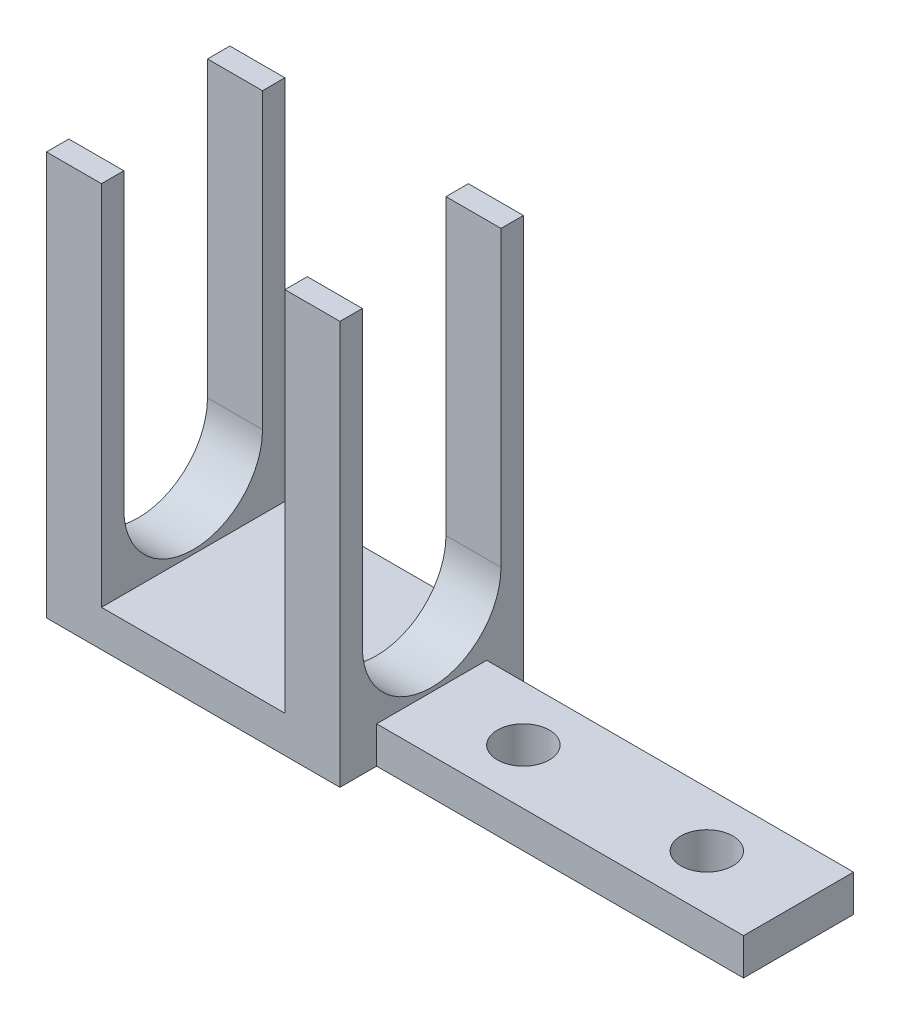
ISO-10303-21;
HEADER;
FILE_DESCRIPTION(('STEP AP214'),'2;1');
FILE_NAME('part.step','',(''),(''),'','','');
FILE_SCHEMA(('AUTOMOTIVE_DESIGN { 1 0 10303 214 1 1 1 1 }'));
ENDSEC;
DATA;
#1=APPLICATION_CONTEXT('core data for automotive mechanical design processes');
#2=APPLICATION_PROTOCOL_DEFINITION('international standard','automotive_design',2000,#1);
#3=PRODUCT_CONTEXT('',#1,'mechanical');
#4=PRODUCT('Part','Part','',(#3));
#5=PRODUCT_RELATED_PRODUCT_CATEGORY('part','',(#4));
#6=PRODUCT_DEFINITION_FORMATION('','',#4);
#7=PRODUCT_DEFINITION_CONTEXT('part definition',#1,'design');
#8=PRODUCT_DEFINITION('design','',#6,#7);
#9=PRODUCT_DEFINITION_SHAPE('','',#8);
#10=(LENGTH_UNIT() NAMED_UNIT(*) SI_UNIT(.MILLI.,.METRE.));
#11=(NAMED_UNIT(*) PLANE_ANGLE_UNIT() SI_UNIT($,.RADIAN.));
#12=(NAMED_UNIT(*) SI_UNIT($,.STERADIAN.) SOLID_ANGLE_UNIT());
#13=UNCERTAINTY_MEASURE_WITH_UNIT(LENGTH_MEASURE(1.E-05),#10,'distance_accuracy_value','');
#14=(GEOMETRIC_REPRESENTATION_CONTEXT(3) GLOBAL_UNCERTAINTY_ASSIGNED_CONTEXT((#13)) GLOBAL_UNIT_ASSIGNED_CONTEXT((#10,
#11,#12)) REPRESENTATION_CONTEXT('',''));
#15=CARTESIAN_POINT('',(0.,0.,0.));
#16=DIRECTION('',(0.,0.,1.));
#17=DIRECTION('',(1.,0.,0.));
#18=AXIS2_PLACEMENT_3D('',#15,#16,#17);
#19=CARTESIAN_POINT('',(20.6375,34.925,0.));
#20=DIRECTION('',(0.,1.,0.));
#21=DIRECTION('',(0.,0.,1.));
#22=AXIS2_PLACEMENT_3D('',#19,#20,#21);
#23=PLANE('',#22);
#24=DIRECTION('',(0.,0.,-1.));
#25=VECTOR('',#24,1.);
#26=CARTESIAN_POINT('',(-15.875,34.925,-7.9375));
#27=LINE('',#26,#25);
#28=CARTESIAN_POINT('',(-15.875,34.925,7.9375));
#29=VERTEX_POINT('',#28);
#30=CARTESIAN_POINT('',(-15.875,34.925,6.));
#31=VERTEX_POINT('',#30);
#32=EDGE_CURVE('E207',#29,#31,#27,.T.);
#33=ORIENTED_EDGE('',*,*,#32,.T.);
#34=DIRECTION('',(-1.,0.,0.));
#35=VECTOR('',#34,1.);
#36=CARTESIAN_POINT('',(20.6375,34.925,6.));
#37=LINE('',#36,#35);
#38=CARTESIAN_POINT('',(-20.6375,34.925,6.));
#39=VERTEX_POINT('',#38);
#40=EDGE_CURVE('E41',#31,#39,#37,.T.);
#41=ORIENTED_EDGE('',*,*,#40,.T.);
#42=DIRECTION('',(0.,0.,1.));
#43=VECTOR('',#42,1.);
#44=CARTESIAN_POINT('',(-20.6375,34.925,-7.9375));
#45=LINE('',#44,#43);
#46=CARTESIAN_POINT('',(-20.6375,34.925,7.9375));
#47=VERTEX_POINT('',#46);
#48=EDGE_CURVE('E203',#39,#47,#45,.T.);
#49=ORIENTED_EDGE('',*,*,#48,.T.);
#50=DIRECTION('',(1.,0.,0.));
#51=VECTOR('',#50,1.);
#52=CARTESIAN_POINT('',(-20.6375,34.925,7.9375));
#53=LINE('',#52,#51);
#54=EDGE_CURVE('E202',#47,#29,#53,.T.);
#55=ORIENTED_EDGE('',*,*,#54,.T.);
#56=EDGE_LOOP('',(#33,#41,#49,#55));
#57=FACE_BOUND('',#56,.T.);
#58=ADVANCED_FACE('F33',(#57),#23,.T.);
#59=CARTESIAN_POINT('',(0.,3.175,0.));
#60=DIRECTION('',(0.,-1.,0.));
#61=DIRECTION('',(0.,0.,-1.));
#62=AXIS2_PLACEMENT_3D('',#59,#60,#61);
#63=PLANE('',#62);
#64=DIRECTION('',(0.,0.,1.));
#65=VECTOR('',#64,1.);
#66=CARTESIAN_POINT('',(-20.6375,3.175,-7.9375));
#67=LINE('',#66,#65);
#68=CARTESIAN_POINT('',(-20.6375,3.175,-7.9375));
#69=VERTEX_POINT('',#68);
#70=CARTESIAN_POINT('',(-20.6375,3.175,7.9375));
#71=VERTEX_POINT('',#70);
#72=EDGE_CURVE('E56',#69,#71,#67,.T.);
#73=ORIENTED_EDGE('',*,*,#72,.F.);
#74=DIRECTION('',(-1.,0.,0.));
#75=VECTOR('',#74,1.);
#76=CARTESIAN_POINT('',(-41.275,3.175,-7.9375));
#77=LINE('',#76,#75);
#78=CARTESIAN_POINT('',(-36.5125,3.175,-7.9375));
#79=VERTEX_POINT('',#78);
#80=EDGE_CURVE('E263',#69,#79,#77,.T.);
#81=ORIENTED_EDGE('',*,*,#80,.T.);
#82=DIRECTION('',(0.,0.,-1.));
#83=VECTOR('',#82,1.);
#84=CARTESIAN_POINT('',(-36.5125,3.175,-7.9375));
#85=LINE('',#84,#83);
#86=CARTESIAN_POINT('',(-36.5125,3.175,7.9375));
#87=VERTEX_POINT('',#86);
#88=EDGE_CURVE('E240',#87,#79,#85,.T.);
#89=ORIENTED_EDGE('',*,*,#88,.F.);
#90=DIRECTION('',(1.,0.,0.));
#91=VECTOR('',#90,1.);
#92=CARTESIAN_POINT('',(-41.275,3.175,7.9375));
#93=LINE('',#92,#91);
#94=EDGE_CURVE('E265',#87,#71,#93,.T.);
#95=ORIENTED_EDGE('',*,*,#94,.T.);
#96=EDGE_LOOP('',(#73,#81,#89,#95));
#97=FACE_BOUND('',#96,.T.);
#98=ADVANCED_FACE('F354',(#97),#63,.F.);
#99=CARTESIAN_POINT('',(-7.9375,3.175,0.));
#100=DIRECTION('',(0.,1.,0.));
#101=DIRECTION('',(0.,0.,1.));
#102=AXIS2_PLACEMENT_3D('',#99,#100,#101);
#103=CIRCLE('',#102,2.24789999999999);
#104=CARTESIAN_POINT('',(-7.9375,3.175,2.24789999999999));
#105=VERTEX_POINT('',#104);
#106=EDGE_CURVE('E288',#105,#105,#103,.T.);
#107=ORIENTED_EDGE('',*,*,#106,.F.);
#108=EDGE_LOOP('',(#107));
#109=FACE_BOUND('',#108,.T.);
#110=CARTESIAN_POINT('',(7.9375,3.175,0.));
#111=DIRECTION('',(0.,1.,0.));
#112=DIRECTION('',(0.,0.,1.));
#113=AXIS2_PLACEMENT_3D('',#110,#111,#112);
#114=CIRCLE('',#113,2.24789999999999);
#115=CARTESIAN_POINT('',(7.9375,3.175,2.24789999999999));
#116=VERTEX_POINT('',#115);
#117=EDGE_CURVE('E294',#116,#116,#114,.T.);
#118=ORIENTED_EDGE('',*,*,#117,.F.);
#119=EDGE_LOOP('',(#118));
#120=FACE_BOUND('',#119,.T.);
#121=DIRECTION('',(0.,0.,-1.));
#122=VECTOR('',#121,1.);
#123=CARTESIAN_POINT('',(-15.875,3.175,-7.9375));
#124=LINE('',#123,#122);
#125=CARTESIAN_POINT('',(-15.875,3.175,4.7625));
#126=VERTEX_POINT('',#125);
#127=CARTESIAN_POINT('',(-15.875,3.175,-4.7625));
#128=VERTEX_POINT('',#127);
#129=EDGE_CURVE('E214',#126,#128,#124,.T.);
#130=ORIENTED_EDGE('',*,*,#129,.F.);
#131=DIRECTION('',(1.,0.,0.));
#132=VECTOR('',#131,1.);
#133=CARTESIAN_POINT('',(-15.875,3.175,4.7625));
#134=LINE('',#133,#132);
#135=CARTESIAN_POINT('',(15.875,3.175,4.7625));
#136=VERTEX_POINT('',#135);
#137=EDGE_CURVE('E307',#126,#136,#134,.T.);
#138=ORIENTED_EDGE('',*,*,#137,.T.);
#139=DIRECTION('',(0.,0.,-1.));
#140=VECTOR('',#139,1.);
#141=CARTESIAN_POINT('',(15.875,3.175,4.7625));
#142=LINE('',#141,#140);
#143=CARTESIAN_POINT('',(15.875,3.175,-4.7625));
#144=VERTEX_POINT('',#143);
#145=EDGE_CURVE('E301',#136,#144,#142,.T.);
#146=ORIENTED_EDGE('',*,*,#145,.T.);
#147=DIRECTION('',(-1.,0.,0.));
#148=VECTOR('',#147,1.);
#149=CARTESIAN_POINT('',(-15.875,3.175,-4.7625));
#150=LINE('',#149,#148);
#151=EDGE_CURVE('E304',#144,#128,#150,.T.);
#152=ORIENTED_EDGE('',*,*,#151,.T.);
#153=EDGE_LOOP('',(#130,#138,#146,#152));
#154=FACE_BOUND('',#153,.T.);
#155=ADVANCED_FACE('F361',(#109,#120,#154),#63,.F.);
#156=CARTESIAN_POINT('',(0.,34.925,0.));
#157=DIRECTION('',(0.,1.,0.));
#158=DIRECTION('',(0.,0.,1.));
#159=AXIS2_PLACEMENT_3D('',#156,#157,#158);
#160=PLANE('',#159);
#161=DIRECTION('',(0.,0.,-1.));
#162=VECTOR('',#161,1.);
#163=CARTESIAN_POINT('',(-36.5125,34.925,-7.9375));
#164=LINE('',#163,#162);
#165=CARTESIAN_POINT('',(-36.5125,34.925,7.9375));
#166=VERTEX_POINT('',#165);
#167=CARTESIAN_POINT('',(-36.5125,34.925,6.));
#168=VERTEX_POINT('',#167);
#169=EDGE_CURVE('E248',#166,#168,#164,.T.);
#170=ORIENTED_EDGE('',*,*,#169,.T.);
#171=DIRECTION('',(-1.,0.,0.));
#172=VECTOR('',#171,1.);
#173=CARTESIAN_POINT('',(0.,34.925,6.));
#174=LINE('',#173,#172);
#175=CARTESIAN_POINT('',(-41.275,34.925,6.));
#176=VERTEX_POINT('',#175);
#177=EDGE_CURVE('E325',#168,#176,#174,.T.);
#178=ORIENTED_EDGE('',*,*,#177,.T.);
#179=DIRECTION('',(0.,0.,1.));
#180=VECTOR('',#179,1.);
#181=CARTESIAN_POINT('',(-41.275,34.925,-7.9375));
#182=LINE('',#181,#180);
#183=CARTESIAN_POINT('',(-41.275,34.925,7.9375));
#184=VERTEX_POINT('',#183);
#185=EDGE_CURVE('E245',#176,#184,#182,.T.);
#186=ORIENTED_EDGE('',*,*,#185,.T.);
#187=DIRECTION('',(1.,0.,0.));
#188=VECTOR('',#187,1.);
#189=CARTESIAN_POINT('',(-41.275,34.925,7.9375));
#190=LINE('',#189,#188);
#191=EDGE_CURVE('E244',#184,#166,#190,.T.);
#192=ORIENTED_EDGE('',*,*,#191,.T.);
#193=EDGE_LOOP('',(#170,#178,#186,#192));
#194=FACE_BOUND('',#193,.T.);
#195=ADVANCED_FACE('F389',(#194),#160,.T.);
#196=CARTESIAN_POINT('',(15.875,3.175,4.7625));
#197=DIRECTION('',(-1.,0.,0.));
#198=DIRECTION('',(0.,0.,1.));
#199=AXIS2_PLACEMENT_3D('',#196,#197,#198);
#200=PLANE('',#199);
#201=DIRECTION('',(0.,0.,-1.));
#202=VECTOR('',#201,1.);
#203=CARTESIAN_POINT('',(15.875,0.,4.7625));
#204=LINE('',#203,#202);
#205=CARTESIAN_POINT('',(15.875,0.,4.7625));
#206=VERTEX_POINT('',#205);
#207=CARTESIAN_POINT('',(15.875,0.,-4.7625));
#208=VERTEX_POINT('',#207);
#209=EDGE_CURVE('E300',#206,#208,#204,.T.);
#210=ORIENTED_EDGE('',*,*,#209,.T.);
#211=DIRECTION('',(0.,-1.,0.));
#212=VECTOR('',#211,1.);
#213=CARTESIAN_POINT('',(15.875,3.175,-4.7625));
#214=LINE('',#213,#212);
#215=EDGE_CURVE('E322',#144,#208,#214,.T.);
#216=ORIENTED_EDGE('',*,*,#215,.F.);
#217=ORIENTED_EDGE('',*,*,#145,.F.);
#218=DIRECTION('',(0.,-1.,0.));
#219=VECTOR('',#218,1.);
#220=CARTESIAN_POINT('',(15.875,3.175,4.7625));
#221=LINE('',#220,#219);
#222=EDGE_CURVE('E309',#136,#206,#221,.T.);
#223=ORIENTED_EDGE('',*,*,#222,.T.);
#224=EDGE_LOOP('',(#210,#216,#217,#223));
#225=FACE_BOUND('',#224,.T.);
#226=ADVANCED_FACE('F35',(#225),#200,.F.);
#227=CARTESIAN_POINT('',(-15.875,3.175,-4.7625));
#228=DIRECTION('',(0.,0.,1.));
#229=DIRECTION('',(1.,0.,0.));
#230=AXIS2_PLACEMENT_3D('',#227,#228,#229);
#231=PLANE('',#230);
#232=DIRECTION('',(-1.,0.,0.));
#233=VECTOR('',#232,1.);
#234=CARTESIAN_POINT('',(-15.875,0.,-4.7625));
#235=LINE('',#234,#233);
#236=CARTESIAN_POINT('',(-15.875,0.,-4.7625));
#237=VERTEX_POINT('',#236);
#238=EDGE_CURVE('E312',#208,#237,#235,.T.);
#239=ORIENTED_EDGE('',*,*,#238,.T.);
#240=DIRECTION('',(0.,-1.,0.));
#241=VECTOR('',#240,1.);
#242=CARTESIAN_POINT('',(-15.875,3.175,-4.7625));
#243=LINE('',#242,#241);
#244=EDGE_CURVE('E319',#128,#237,#243,.T.);
#245=ORIENTED_EDGE('',*,*,#244,.F.);
#246=ORIENTED_EDGE('',*,*,#151,.F.);
#247=ORIENTED_EDGE('',*,*,#215,.T.);
#248=EDGE_LOOP('',(#239,#245,#246,#247));
#249=FACE_BOUND('',#248,.T.);
#250=ADVANCED_FACE('F410',(#249),#231,.F.);
#251=CARTESIAN_POINT('',(-15.875,3.175,4.7625));
#252=DIRECTION('',(0.,0.,-1.));
#253=DIRECTION('',(-1.,0.,0.));
#254=AXIS2_PLACEMENT_3D('',#251,#252,#253);
#255=PLANE('',#254);
#256=DIRECTION('',(1.,0.,0.));
#257=VECTOR('',#256,1.);
#258=CARTESIAN_POINT('',(-15.875,0.,4.7625));
#259=LINE('',#258,#257);
#260=CARTESIAN_POINT('',(-15.875,0.,4.7625));
#261=VERTEX_POINT('',#260);
#262=EDGE_CURVE('E305',#261,#206,#259,.T.);
#263=ORIENTED_EDGE('',*,*,#262,.T.);
#264=ORIENTED_EDGE('',*,*,#222,.F.);
#265=ORIENTED_EDGE('',*,*,#137,.F.);
#266=DIRECTION('',(0.,-1.,0.));
#267=VECTOR('',#266,1.);
#268=CARTESIAN_POINT('',(-15.875,3.175,4.7625));
#269=LINE('',#268,#267);
#270=EDGE_CURVE('E317',#126,#261,#269,.T.);
#271=ORIENTED_EDGE('',*,*,#270,.T.);
#272=EDGE_LOOP('',(#263,#264,#265,#271));
#273=FACE_BOUND('',#272,.T.);
#274=ADVANCED_FACE('F403',(#273),#255,.F.);
#275=CARTESIAN_POINT('',(0.,0.,0.));
#276=DIRECTION('',(0.,-1.,0.));
#277=DIRECTION('',(0.,0.,-1.));
#278=AXIS2_PLACEMENT_3D('',#275,#276,#277);
#279=PLANE('',#278);
#280=CARTESIAN_POINT('',(-7.9375,0.,0.));
#281=DIRECTION('',(0.,1.,0.));
#282=DIRECTION('',(0.,0.,1.));
#283=AXIS2_PLACEMENT_3D('',#280,#281,#282);
#284=CIRCLE('',#283,2.2479);
#285=CARTESIAN_POINT('',(-7.9375,0.,2.2479));
#286=VERTEX_POINT('',#285);
#287=EDGE_CURVE('E291',#286,#286,#284,.T.);
#288=ORIENTED_EDGE('',*,*,#287,.T.);
#289=EDGE_LOOP('',(#288));
#290=FACE_BOUND('',#289,.T.);
#291=CARTESIAN_POINT('',(7.9375,0.,0.));
#292=DIRECTION('',(0.,1.,0.));
#293=DIRECTION('',(0.,0.,1.));
#294=AXIS2_PLACEMENT_3D('',#291,#292,#293);
#295=CIRCLE('',#294,2.2479);
#296=CARTESIAN_POINT('',(7.9375,0.,2.2479));
#297=VERTEX_POINT('',#296);
#298=EDGE_CURVE('E297',#297,#297,#295,.T.);
#299=ORIENTED_EDGE('',*,*,#298,.T.);
#300=EDGE_LOOP('',(#299));
#301=FACE_BOUND('',#300,.T.);
#302=ORIENTED_EDGE('',*,*,#209,.F.);
#303=ORIENTED_EDGE('',*,*,#262,.F.);
#304=DIRECTION('',(0.,0.,-1.));
#305=VECTOR('',#304,1.);
#306=CARTESIAN_POINT('',(-15.875,0.,7.9375));
#307=LINE('',#306,#305);
#308=CARTESIAN_POINT('',(-15.875,0.,7.9375));
#309=VERTEX_POINT('',#308);
#310=EDGE_CURVE('E269',#309,#261,#307,.T.);
#311=ORIENTED_EDGE('',*,*,#310,.F.);
#312=DIRECTION('',(1.,0.,0.));
#313=VECTOR('',#312,1.);
#314=CARTESIAN_POINT('',(-41.275,0.,7.9375));
#315=LINE('',#314,#313);
#316=CARTESIAN_POINT('',(-41.275,0.,7.9375));
#317=VERTEX_POINT('',#316);
#318=EDGE_CURVE('E266',#317,#309,#315,.T.);
#319=ORIENTED_EDGE('',*,*,#318,.F.);
#320=DIRECTION('',(0.,0.,1.));
#321=VECTOR('',#320,1.);
#322=CARTESIAN_POINT('',(-41.275,0.,7.9375));
#323=LINE('',#322,#321);
#324=CARTESIAN_POINT('',(-41.275,0.,-7.9375));
#325=VERTEX_POINT('',#324);
#326=EDGE_CURVE('E274',#325,#317,#323,.T.);
#327=ORIENTED_EDGE('',*,*,#326,.F.);
#328=DIRECTION('',(-1.,0.,0.));
#329=VECTOR('',#328,1.);
#330=CARTESIAN_POINT('',(-41.275,0.,-7.9375));
#331=LINE('',#330,#329);
#332=CARTESIAN_POINT('',(-15.875,0.,-7.9375));
#333=VERTEX_POINT('',#332);
#334=EDGE_CURVE('E272',#333,#325,#331,.T.);
#335=ORIENTED_EDGE('',*,*,#334,.F.);
#336=EDGE_CURVE('E262',#237,#333,#307,.T.);
#337=ORIENTED_EDGE('',*,*,#336,.F.);
#338=ORIENTED_EDGE('',*,*,#238,.F.);
#339=EDGE_LOOP('',(#302,#303,#311,#319,#327,#335,#337,#338));
#340=FACE_BOUND('',#339,.T.);
#341=ADVANCED_FACE('F398',(#290,#301,#340),#279,.T.);
#342=CARTESIAN_POINT('',(7.9375,3.175,0.));
#343=DIRECTION('',(0.,1.,0.));
#344=DIRECTION('',(0.,0.,1.));
#345=AXIS2_PLACEMENT_3D('',#342,#343,#344);
#346=CYLINDRICAL_SURFACE('',#345,2.24789999999999);
#347=ORIENTED_EDGE('',*,*,#298,.F.);
#348=EDGE_LOOP('',(#347));
#349=FACE_BOUND('',#348,.T.);
#350=ORIENTED_EDGE('',*,*,#117,.T.);
#351=EDGE_LOOP('',(#350));
#352=FACE_BOUND('',#351,.T.);
#353=ADVANCED_FACE('F489',(#349,#352),#346,.F.);
#354=CARTESIAN_POINT('',(-7.9375,3.175,0.));
#355=DIRECTION('',(0.,1.,0.));
#356=DIRECTION('',(0.,0.,1.));
#357=AXIS2_PLACEMENT_3D('',#354,#355,#356);
#358=CYLINDRICAL_SURFACE('',#357,2.24789999999999);
#359=ORIENTED_EDGE('',*,*,#287,.F.);
#360=EDGE_LOOP('',(#359));
#361=FACE_BOUND('',#360,.T.);
#362=ORIENTED_EDGE('',*,*,#106,.T.);
#363=EDGE_LOOP('',(#362));
#364=FACE_BOUND('',#363,.T.);
#365=ADVANCED_FACE('F499',(#361,#364),#358,.F.);
#366=CARTESIAN_POINT('',(-15.875,3.175,7.9375));
#367=DIRECTION('',(-1.,0.,0.));
#368=DIRECTION('',(0.,0.,1.));
#369=AXIS2_PLACEMENT_3D('',#366,#367,#368);
#370=PLANE('',#369);
#371=CARTESIAN_POINT('',(-15.875,34.925,-6.));
#372=VERTEX_POINT('',#371);
#373=CARTESIAN_POINT('',(-15.875,34.925,-7.9375));
#374=VERTEX_POINT('',#373);
#375=EDGE_CURVE('E206',#372,#374,#27,.T.);
#376=ORIENTED_EDGE('',*,*,#375,.F.);
#377=DIRECTION('',(0.,-1.,0.));
#378=VECTOR('',#377,1.);
#379=CARTESIAN_POINT('',(-15.875,3.175,-5.99999999999999));
#380=LINE('',#379,#378);
#381=CARTESIAN_POINT('',(-15.875,9.525,-6.));
#382=VERTEX_POINT('',#381);
#383=EDGE_CURVE('E197',#372,#382,#380,.T.);
#384=ORIENTED_EDGE('',*,*,#383,.T.);
#385=CARTESIAN_POINT('',(-15.875,9.525,0.));
#386=DIRECTION('',(-1.,0.,0.));
#387=DIRECTION('',(0.,0.,1.));
#388=AXIS2_PLACEMENT_3D('',#385,#386,#387);
#389=CIRCLE('',#388,6.);
#390=CARTESIAN_POINT('',(-15.875,9.525,6.));
#391=VERTEX_POINT('',#390);
#392=EDGE_CURVE('E176',#382,#391,#389,.T.);
#393=ORIENTED_EDGE('',*,*,#392,.T.);
#394=DIRECTION('',(0.,-1.,0.));
#395=VECTOR('',#394,1.);
#396=CARTESIAN_POINT('',(-15.875,3.175,6.));
#397=LINE('',#396,#395);
#398=EDGE_CURVE('E194',#31,#391,#397,.T.);
#399=ORIENTED_EDGE('',*,*,#398,.F.);
#400=ORIENTED_EDGE('',*,*,#32,.F.);
#401=DIRECTION('',(0.,-1.,0.));
#402=VECTOR('',#401,1.);
#403=CARTESIAN_POINT('',(-15.875,3.175,7.9375));
#404=LINE('',#403,#402);
#405=EDGE_CURVE('E268',#29,#309,#404,.T.);
#406=ORIENTED_EDGE('',*,*,#405,.T.);
#407=ORIENTED_EDGE('',*,*,#310,.T.);
#408=ORIENTED_EDGE('',*,*,#270,.F.);
#409=ORIENTED_EDGE('',*,*,#129,.T.);
#410=ORIENTED_EDGE('',*,*,#244,.T.);
#411=ORIENTED_EDGE('',*,*,#336,.T.);
#412=DIRECTION('',(0.,-1.,0.));
#413=VECTOR('',#412,1.);
#414=CARTESIAN_POINT('',(-15.875,3.175,-7.9375));
#415=LINE('',#414,#413);
#416=EDGE_CURVE('E285',#374,#333,#415,.T.);
#417=ORIENTED_EDGE('',*,*,#416,.F.);
#418=EDGE_LOOP('',(#376,#384,#393,#399,#400,#406,#407,#408,#409,#410,#411,#417));
#419=FACE_BOUND('',#418,.T.);
#420=ADVANCED_FACE('F343',(#419),#370,.F.);
#421=CARTESIAN_POINT('',(-41.275,3.175,-7.9375));
#422=DIRECTION('',(0.,0.,1.));
#423=DIRECTION('',(1.,0.,0.));
#424=AXIS2_PLACEMENT_3D('',#421,#422,#423);
#425=PLANE('',#424);
#426=ORIENTED_EDGE('',*,*,#334,.T.);
#427=DIRECTION('',(0.,-1.,0.));
#428=VECTOR('',#427,1.);
#429=CARTESIAN_POINT('',(-41.275,3.175,-7.9375));
#430=LINE('',#429,#428);
#431=CARTESIAN_POINT('',(-41.275,34.925,-7.9375));
#432=VERTEX_POINT('',#431);
#433=EDGE_CURVE('E282',#432,#325,#430,.T.);
#434=ORIENTED_EDGE('',*,*,#433,.F.);
#435=DIRECTION('',(-1.,0.,0.));
#436=VECTOR('',#435,1.);
#437=CARTESIAN_POINT('',(-41.275,34.925,-7.9375));
#438=LINE('',#437,#436);
#439=CARTESIAN_POINT('',(-36.5125,34.925,-7.9375));
#440=VERTEX_POINT('',#439);
#441=EDGE_CURVE('E251',#440,#432,#438,.T.);
#442=ORIENTED_EDGE('',*,*,#441,.F.);
#443=DIRECTION('',(0.,-1.,0.));
#444=VECTOR('',#443,1.);
#445=CARTESIAN_POINT('',(-36.5125,34.925,-7.9375));
#446=LINE('',#445,#444);
#447=EDGE_CURVE('E254',#440,#79,#446,.T.);
#448=ORIENTED_EDGE('',*,*,#447,.T.);
#449=ORIENTED_EDGE('',*,*,#80,.F.);
#450=DIRECTION('',(0.,-1.,0.));
#451=VECTOR('',#450,1.);
#452=CARTESIAN_POINT('',(-20.6375,34.925,-7.9375));
#453=LINE('',#452,#451);
#454=CARTESIAN_POINT('',(-20.6375,34.925,-7.9375));
#455=VERTEX_POINT('',#454);
#456=EDGE_CURVE('E212',#455,#69,#453,.T.);
#457=ORIENTED_EDGE('',*,*,#456,.F.);
#458=DIRECTION('',(-1.,0.,0.));
#459=VECTOR('',#458,1.);
#460=CARTESIAN_POINT('',(-20.6375,34.925,-7.9375));
#461=LINE('',#460,#459);
#462=EDGE_CURVE('E210',#374,#455,#461,.T.);
#463=ORIENTED_EDGE('',*,*,#462,.F.);
#464=ORIENTED_EDGE('',*,*,#416,.T.);
#465=EDGE_LOOP('',(#426,#434,#442,#448,#449,#457,#463,#464));
#466=FACE_BOUND('',#465,.T.);
#467=ADVANCED_FACE('F377',(#466),#425,.F.);
#468=CARTESIAN_POINT('',(-41.275,3.175,7.9375));
#469=DIRECTION('',(1.,0.,0.));
#470=DIRECTION('',(0.,0.,-1.));
#471=AXIS2_PLACEMENT_3D('',#468,#469,#470);
#472=PLANE('',#471);
#473=CARTESIAN_POINT('',(-41.275,9.525,0.));
#474=DIRECTION('',(-1.,0.,0.));
#475=DIRECTION('',(0.,0.,1.));
#476=AXIS2_PLACEMENT_3D('',#473,#474,#475);
#477=CIRCLE('',#476,6.);
#478=CARTESIAN_POINT('',(-41.275,9.525,-6.));
#479=VERTEX_POINT('',#478);
#480=CARTESIAN_POINT('',(-41.275,9.525,6.));
#481=VERTEX_POINT('',#480);
#482=EDGE_CURVE('E225',#479,#481,#477,.T.);
#483=ORIENTED_EDGE('',*,*,#482,.F.);
#484=DIRECTION('',(0.,-1.,0.));
#485=VECTOR('',#484,1.);
#486=CARTESIAN_POINT('',(-41.275,34.925,-6.));
#487=LINE('',#486,#485);
#488=CARTESIAN_POINT('',(-41.275,34.925,-6.));
#489=VERTEX_POINT('',#488);
#490=EDGE_CURVE('E222',#489,#479,#487,.T.);
#491=ORIENTED_EDGE('',*,*,#490,.F.);
#492=EDGE_CURVE('E241',#432,#489,#182,.T.);
#493=ORIENTED_EDGE('',*,*,#492,.F.);
#494=ORIENTED_EDGE('',*,*,#433,.T.);
#495=ORIENTED_EDGE('',*,*,#326,.T.);
#496=DIRECTION('',(0.,-1.,0.));
#497=VECTOR('',#496,1.);
#498=CARTESIAN_POINT('',(-41.275,3.175,7.9375));
#499=LINE('',#498,#497);
#500=EDGE_CURVE('E279',#184,#317,#499,.T.);
#501=ORIENTED_EDGE('',*,*,#500,.F.);
#502=ORIENTED_EDGE('',*,*,#185,.F.);
#503=DIRECTION('',(0.,-1.,0.));
#504=VECTOR('',#503,1.);
#505=CARTESIAN_POINT('',(-41.275,34.925,6.));
#506=LINE('',#505,#504);
#507=EDGE_CURVE('E228',#176,#481,#506,.T.);
#508=ORIENTED_EDGE('',*,*,#507,.T.);
#509=EDGE_LOOP('',(#483,#491,#493,#494,#495,#501,#502,#508));
#510=FACE_BOUND('',#509,.T.);
#511=ADVANCED_FACE('F393',(#510),#472,.F.);
#512=CARTESIAN_POINT('',(-41.275,3.175,7.9375));
#513=DIRECTION('',(0.,0.,-1.));
#514=DIRECTION('',(-1.,0.,0.));
#515=AXIS2_PLACEMENT_3D('',#512,#513,#514);
#516=PLANE('',#515);
#517=ORIENTED_EDGE('',*,*,#318,.T.);
#518=ORIENTED_EDGE('',*,*,#405,.F.);
#519=ORIENTED_EDGE('',*,*,#54,.F.);
#520=DIRECTION('',(0.,-1.,0.));
#521=VECTOR('',#520,1.);
#522=CARTESIAN_POINT('',(-20.6375,34.925,7.9375));
#523=LINE('',#522,#521);
#524=EDGE_CURVE('E219',#47,#71,#523,.T.);
#525=ORIENTED_EDGE('',*,*,#524,.T.);
#526=ORIENTED_EDGE('',*,*,#94,.F.);
#527=DIRECTION('',(0.,-1.,0.));
#528=VECTOR('',#527,1.);
#529=CARTESIAN_POINT('',(-36.5125,34.925,7.9375));
#530=LINE('',#529,#528);
#531=EDGE_CURVE('E259',#166,#87,#530,.T.);
#532=ORIENTED_EDGE('',*,*,#531,.F.);
#533=ORIENTED_EDGE('',*,*,#191,.F.);
#534=ORIENTED_EDGE('',*,*,#500,.T.);
#535=EDGE_LOOP('',(#517,#518,#519,#525,#526,#532,#533,#534));
#536=FACE_BOUND('',#535,.T.);
#537=ADVANCED_FACE('F339',(#536),#516,.F.);
#538=CARTESIAN_POINT('',(-36.5125,34.925,-7.9375));
#539=DIRECTION('',(-1.,0.,0.));
#540=DIRECTION('',(0.,0.,1.));
#541=AXIS2_PLACEMENT_3D('',#538,#539,#540);
#542=PLANE('',#541);
#543=CARTESIAN_POINT('',(-36.5125,34.925,-6.));
#544=VERTEX_POINT('',#543);
#545=EDGE_CURVE('E247',#544,#440,#164,.T.);
#546=ORIENTED_EDGE('',*,*,#545,.F.);
#547=DIRECTION('',(0.,-1.,0.));
#548=VECTOR('',#547,1.);
#549=CARTESIAN_POINT('',(-36.5125,34.925,-6.));
#550=LINE('',#549,#548);
#551=CARTESIAN_POINT('',(-36.5125,9.525,-6.));
#552=VERTEX_POINT('',#551);
#553=EDGE_CURVE('E237',#544,#552,#550,.T.);
#554=ORIENTED_EDGE('',*,*,#553,.T.);
#555=CARTESIAN_POINT('',(-36.5125,9.525,0.));
#556=DIRECTION('',(-1.,0.,0.));
#557=DIRECTION('',(0.,0.,1.));
#558=AXIS2_PLACEMENT_3D('',#555,#556,#557);
#559=CIRCLE('',#558,6.);
#560=CARTESIAN_POINT('',(-36.5125,9.525,6.));
#561=VERTEX_POINT('',#560);
#562=EDGE_CURVE('E330',#552,#561,#559,.T.);
#563=ORIENTED_EDGE('',*,*,#562,.T.);
#564=DIRECTION('',(0.,-1.,0.));
#565=VECTOR('',#564,1.);
#566=CARTESIAN_POINT('',(-36.5125,34.925,6.));
#567=LINE('',#566,#565);
#568=EDGE_CURVE('E234',#168,#561,#567,.T.);
#569=ORIENTED_EDGE('',*,*,#568,.F.);
#570=ORIENTED_EDGE('',*,*,#169,.F.);
#571=ORIENTED_EDGE('',*,*,#531,.T.);
#572=ORIENTED_EDGE('',*,*,#88,.T.);
#573=ORIENTED_EDGE('',*,*,#447,.F.);
#574=EDGE_LOOP('',(#546,#554,#563,#569,#570,#571,#572,#573));
#575=FACE_BOUND('',#574,.T.);
#576=ADVANCED_FACE('F382',(#575),#542,.F.);
#577=DIRECTION('',(-1.,0.,0.));
#578=VECTOR('',#577,1.);
#579=CARTESIAN_POINT('',(15.875,34.925,-6.));
#580=LINE('',#579,#578);
#581=EDGE_CURVE('E328',#544,#489,#580,.T.);
#582=ORIENTED_EDGE('',*,*,#581,.F.);
#583=ORIENTED_EDGE('',*,*,#545,.T.);
#584=ORIENTED_EDGE('',*,*,#441,.T.);
#585=ORIENTED_EDGE('',*,*,#492,.T.);
#586=EDGE_LOOP('',(#582,#583,#584,#585));
#587=FACE_BOUND('',#586,.T.);
#588=ADVANCED_FACE('F419',(#587),#160,.T.);
#589=CARTESIAN_POINT('',(15.875,9.525,0.));
#590=DIRECTION('',(-1.,0.,0.));
#591=DIRECTION('',(0.,0.,1.));
#592=AXIS2_PLACEMENT_3D('',#589,#590,#591);
#593=CYLINDRICAL_SURFACE('',#592,6.);
#594=DIRECTION('',(-1.,0.,0.));
#595=VECTOR('',#594,1.);
#596=CARTESIAN_POINT('',(15.875,9.525,-6.));
#597=LINE('',#596,#595);
#598=EDGE_CURVE('E231',#552,#479,#597,.T.);
#599=ORIENTED_EDGE('',*,*,#598,.T.);
#600=ORIENTED_EDGE('',*,*,#482,.T.);
#601=DIRECTION('',(-1.,0.,0.));
#602=VECTOR('',#601,1.);
#603=CARTESIAN_POINT('',(15.875,9.525,6.));
#604=LINE('',#603,#602);
#605=EDGE_CURVE('E232',#561,#481,#604,.T.);
#606=ORIENTED_EDGE('',*,*,#605,.F.);
#607=ORIENTED_EDGE('',*,*,#562,.F.);
#608=EDGE_LOOP('',(#599,#600,#606,#607));
#609=FACE_BOUND('',#608,.T.);
#610=ADVANCED_FACE('F428',(#609),#593,.F.);
#611=CARTESIAN_POINT('',(15.875,34.925,-6.));
#612=DIRECTION('',(0.,0.,-1.));
#613=DIRECTION('',(0.,1.,0.));
#614=AXIS2_PLACEMENT_3D('',#611,#612,#613);
#615=PLANE('',#614);
#616=ORIENTED_EDGE('',*,*,#581,.T.);
#617=ORIENTED_EDGE('',*,*,#490,.T.);
#618=ORIENTED_EDGE('',*,*,#598,.F.);
#619=ORIENTED_EDGE('',*,*,#553,.F.);
#620=EDGE_LOOP('',(#616,#617,#618,#619));
#621=FACE_BOUND('',#620,.T.);
#622=ADVANCED_FACE('F434',(#621),#615,.F.);
#623=CARTESIAN_POINT('',(15.875,34.925,6.));
#624=DIRECTION('',(0.,0.,-1.));
#625=DIRECTION('',(0.,1.,0.));
#626=AXIS2_PLACEMENT_3D('',#623,#624,#625);
#627=PLANE('',#626);
#628=ORIENTED_EDGE('',*,*,#568,.T.);
#629=ORIENTED_EDGE('',*,*,#605,.T.);
#630=ORIENTED_EDGE('',*,*,#507,.F.);
#631=ORIENTED_EDGE('',*,*,#177,.F.);
#632=EDGE_LOOP('',(#628,#629,#630,#631));
#633=FACE_BOUND('',#632,.T.);
#634=ADVANCED_FACE('F370',(#633),#627,.T.);
#635=CARTESIAN_POINT('',(-20.6375,34.925,-7.9375));
#636=DIRECTION('',(1.,0.,0.));
#637=DIRECTION('',(0.,0.,-1.));
#638=AXIS2_PLACEMENT_3D('',#635,#636,#637);
#639=PLANE('',#638);
#640=CARTESIAN_POINT('',(-20.6375,9.525,0.));
#641=DIRECTION('',(-1.,0.,0.));
#642=DIRECTION('',(0.,0.,1.));
#643=AXIS2_PLACEMENT_3D('',#640,#641,#642);
#644=CIRCLE('',#643,6.);
#645=CARTESIAN_POINT('',(-20.6375,9.525,-6.));
#646=VERTEX_POINT('',#645);
#647=CARTESIAN_POINT('',(-20.6375,9.525,6.));
#648=VERTEX_POINT('',#647);
#649=EDGE_CURVE('E174',#646,#648,#644,.T.);
#650=ORIENTED_EDGE('',*,*,#649,.F.);
#651=DIRECTION('',(0.,-1.,0.));
#652=VECTOR('',#651,1.);
#653=CARTESIAN_POINT('',(-20.6375,34.925,-6.));
#654=LINE('',#653,#652);
#655=CARTESIAN_POINT('',(-20.6375,34.925,-6.));
#656=VERTEX_POINT('',#655);
#657=EDGE_CURVE('E182',#656,#646,#654,.T.);
#658=ORIENTED_EDGE('',*,*,#657,.F.);
#659=EDGE_CURVE('E200',#455,#656,#45,.T.);
#660=ORIENTED_EDGE('',*,*,#659,.F.);
#661=ORIENTED_EDGE('',*,*,#456,.T.);
#662=ORIENTED_EDGE('',*,*,#72,.T.);
#663=ORIENTED_EDGE('',*,*,#524,.F.);
#664=ORIENTED_EDGE('',*,*,#48,.F.);
#665=DIRECTION('',(0.,-1.,0.));
#666=VECTOR('',#665,1.);
#667=CARTESIAN_POINT('',(-20.6375,34.925,6.));
#668=LINE('',#667,#666);
#669=EDGE_CURVE('E48',#39,#648,#668,.T.);
#670=ORIENTED_EDGE('',*,*,#669,.T.);
#671=EDGE_LOOP('',(#650,#658,#660,#661,#662,#663,#664,#670));
#672=FACE_BOUND('',#671,.T.);
#673=ADVANCED_FACE('F189',(#672),#639,.F.);
#674=DIRECTION('',(-1.,0.,0.));
#675=VECTOR('',#674,1.);
#676=CARTESIAN_POINT('',(15.875,34.925,-6.));
#677=LINE('',#676,#675);
#678=EDGE_CURVE('E11',#372,#656,#677,.T.);
#679=ORIENTED_EDGE('',*,*,#678,.F.);
#680=ORIENTED_EDGE('',*,*,#375,.T.);
#681=ORIENTED_EDGE('',*,*,#462,.T.);
#682=ORIENTED_EDGE('',*,*,#659,.T.);
#683=EDGE_LOOP('',(#679,#680,#681,#682));
#684=FACE_BOUND('',#683,.T.);
#685=ADVANCED_FACE('F356',(#684),#23,.T.);
#686=CARTESIAN_POINT('',(15.875,9.525,0.));
#687=DIRECTION('',(-1.,0.,0.));
#688=DIRECTION('',(0.,0.,1.));
#689=AXIS2_PLACEMENT_3D('',#686,#687,#688);
#690=CYLINDRICAL_SURFACE('',#689,6.);
#691=DIRECTION('',(-1.,0.,0.));
#692=VECTOR('',#691,1.);
#693=CARTESIAN_POINT('',(15.875,9.525,-6.));
#694=LINE('',#693,#692);
#695=EDGE_CURVE('E169',#382,#646,#694,.T.);
#696=ORIENTED_EDGE('',*,*,#695,.T.);
#697=ORIENTED_EDGE('',*,*,#649,.T.);
#698=DIRECTION('',(-1.,0.,0.));
#699=VECTOR('',#698,1.);
#700=CARTESIAN_POINT('',(15.875,9.525,6.));
#701=LINE('',#700,#699);
#702=EDGE_CURVE('E179',#391,#648,#701,.T.);
#703=ORIENTED_EDGE('',*,*,#702,.F.);
#704=ORIENTED_EDGE('',*,*,#392,.F.);
#705=EDGE_LOOP('',(#696,#697,#703,#704));
#706=FACE_BOUND('',#705,.T.);
#707=ADVANCED_FACE('F171',(#706),#690,.F.);
#708=CARTESIAN_POINT('',(15.875,34.925,-6.));
#709=DIRECTION('',(0.,0.,-1.));
#710=DIRECTION('',(0.,1.,0.));
#711=AXIS2_PLACEMENT_3D('',#708,#709,#710);
#712=PLANE('',#711);
#713=ORIENTED_EDGE('',*,*,#678,.T.);
#714=ORIENTED_EDGE('',*,*,#657,.T.);
#715=ORIENTED_EDGE('',*,*,#695,.F.);
#716=ORIENTED_EDGE('',*,*,#383,.F.);
#717=EDGE_LOOP('',(#713,#714,#715,#716));
#718=FACE_BOUND('',#717,.T.);
#719=ADVANCED_FACE('F183',(#718),#712,.F.);
#720=CARTESIAN_POINT('',(15.875,34.925,6.));
#721=DIRECTION('',(0.,0.,-1.));
#722=DIRECTION('',(0.,1.,0.));
#723=AXIS2_PLACEMENT_3D('',#720,#721,#722);
#724=PLANE('',#723);
#725=ORIENTED_EDGE('',*,*,#398,.T.);
#726=ORIENTED_EDGE('',*,*,#702,.T.);
#727=ORIENTED_EDGE('',*,*,#669,.F.);
#728=ORIENTED_EDGE('',*,*,#40,.F.);
#729=EDGE_LOOP('',(#725,#726,#727,#728));
#730=FACE_BOUND('',#729,.T.);
#731=ADVANCED_FACE('F345',(#730),#724,.T.);
#732=CLOSED_SHELL('',(#58,#98,#155,#195,#226,#250,#274,#341,#353,#365,#420,#467,#511,#537,#576,
#588,#610,#622,#634,#673,#685,#707,#719,#731));
#733=MANIFOLD_SOLID_BREP('B2',#732);
#734=ADVANCED_BREP_SHAPE_REPRESENTATION('',(#18,#733),#14);
#735=SHAPE_DEFINITION_REPRESENTATION(#9,#734);
ENDSEC;
END-ISO-10303-21;
